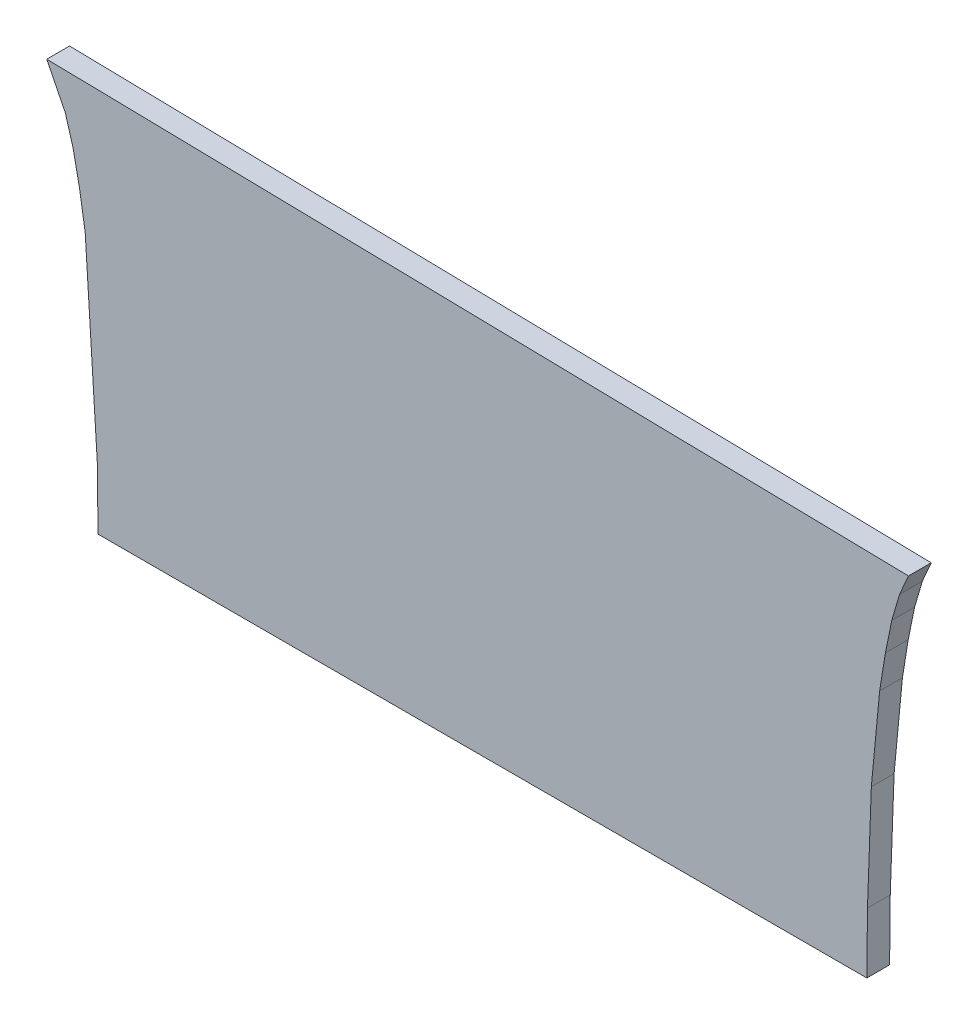
ISO-10303-21;
HEADER;
FILE_DESCRIPTION(('STEP AP214'),'2;1');
FILE_NAME('part.step','',(''),(''),'','','');
FILE_SCHEMA(('AUTOMOTIVE_DESIGN { 1 0 10303 214 1 1 1 1 }'));
ENDSEC;
DATA;
#1=APPLICATION_CONTEXT('core data for automotive mechanical design processes');
#2=APPLICATION_PROTOCOL_DEFINITION('international standard','automotive_design',2000,#1);
#3=PRODUCT_CONTEXT('',#1,'mechanical');
#4=PRODUCT('Part','Part','',(#3));
#5=PRODUCT_RELATED_PRODUCT_CATEGORY('part','',(#4));
#6=PRODUCT_DEFINITION_FORMATION('','',#4);
#7=PRODUCT_DEFINITION_CONTEXT('part definition',#1,'design');
#8=PRODUCT_DEFINITION('design','',#6,#7);
#9=PRODUCT_DEFINITION_SHAPE('','',#8);
#10=(LENGTH_UNIT() NAMED_UNIT(*) SI_UNIT(.MILLI.,.METRE.));
#11=(NAMED_UNIT(*) PLANE_ANGLE_UNIT() SI_UNIT($,.RADIAN.));
#12=(NAMED_UNIT(*) SI_UNIT($,.STERADIAN.) SOLID_ANGLE_UNIT());
#13=UNCERTAINTY_MEASURE_WITH_UNIT(LENGTH_MEASURE(1.E-05),#10,'distance_accuracy_value','');
#14=(GEOMETRIC_REPRESENTATION_CONTEXT(3) GLOBAL_UNCERTAINTY_ASSIGNED_CONTEXT((#13)) GLOBAL_UNIT_ASSIGNED_CONTEXT((#10,
#11,#12)) REPRESENTATION_CONTEXT('',''));
#15=CARTESIAN_POINT('',(0.,0.,0.));
#16=DIRECTION('',(0.,0.,1.));
#17=DIRECTION('',(1.,0.,0.));
#18=AXIS2_PLACEMENT_3D('',#15,#16,#17);
#19=CARTESIAN_POINT('',(67.379997253418,84.3880004882812,0.));
#20=DIRECTION('',(-0.999944665202742,0.010519816185477,0.));
#21=DIRECTION('',(0.010519816185477,0.999944665202742,0.));
#22=AXIS2_PLACEMENT_3D('',#19,#20,#21);
#23=PLANE('',#22);
#24=DIRECTION('',(0.010519816185477,0.999944665202742,0.));
#25=VECTOR('',#24,1.);
#26=CARTESIAN_POINT('',(67.379997253418,84.3880004882812,0.03556));
#27=LINE('',#26,#25);
#28=CARTESIAN_POINT('',(67.379997253418,84.3880004882812,0.03556));
#29=VERTEX_POINT('',#28);
#30=CARTESIAN_POINT('',(67.3809967041016,84.4830017089844,0.03556));
#31=VERTEX_POINT('',#30);
#32=EDGE_CURVE('E11',#29,#31,#27,.T.);
#33=ORIENTED_EDGE('',*,*,#32,.F.);
#34=DIRECTION('',(0.,0.,1.));
#35=VECTOR('',#34,1.);
#36=CARTESIAN_POINT('',(67.379997253418,84.3880004882812,0.));
#37=LINE('',#36,#35);
#38=CARTESIAN_POINT('',(67.379997253418,84.3880004882812,0.));
#39=VERTEX_POINT('',#38);
#40=EDGE_CURVE('E24',#39,#29,#37,.T.);
#41=ORIENTED_EDGE('',*,*,#40,.F.);
#42=DIRECTION('',(0.010519816185477,0.999944665202742,0.));
#43=VECTOR('',#42,1.);
#44=CARTESIAN_POINT('',(67.379997253418,84.3880004882812,0.));
#45=LINE('',#44,#43);
#46=CARTESIAN_POINT('',(67.3809967041016,84.4830017089844,0.));
#47=VERTEX_POINT('',#46);
#48=EDGE_CURVE('E142',#39,#47,#45,.T.);
#49=ORIENTED_EDGE('',*,*,#48,.T.);
#50=DIRECTION('',(0.,0.,1.));
#51=VECTOR('',#50,1.);
#52=CARTESIAN_POINT('',(67.3809967041016,84.4830017089844,0.));
#53=LINE('',#52,#51);
#54=EDGE_CURVE('E37',#47,#31,#53,.T.);
#55=ORIENTED_EDGE('',*,*,#54,.T.);
#56=EDGE_LOOP('',(#33,#41,#49,#55));
#57=FACE_BOUND('',#56,.T.);
#58=ADVANCED_FACE('F17',(#57),#23,.F.);
#59=CARTESIAN_POINT('',(67.3809967041016,84.4830017089844,0.));
#60=DIRECTION('',(-0.999354276166242,0.0359309157724351,0.));
#61=DIRECTION('',(0.0359309157724351,0.999354276166242,0.));
#62=AXIS2_PLACEMENT_3D('',#59,#60,#61);
#63=PLANE('',#62);
#64=DIRECTION('',(0.0359309157724351,0.999354276166242,0.));
#65=VECTOR('',#64,1.);
#66=CARTESIAN_POINT('',(67.3809967041016,84.4830017089844,0.03556));
#67=LINE('',#66,#65);
#68=CARTESIAN_POINT('',(67.3870010375977,84.6500015258789,0.03556));
#69=VERTEX_POINT('',#68);
#70=EDGE_CURVE('E238',#31,#69,#67,.T.);
#71=ORIENTED_EDGE('',*,*,#70,.F.);
#72=ORIENTED_EDGE('',*,*,#54,.F.);
#73=DIRECTION('',(0.0359309157724351,0.999354276166242,0.));
#74=VECTOR('',#73,1.);
#75=CARTESIAN_POINT('',(67.3809967041016,84.4830017089844,0.));
#76=LINE('',#75,#74);
#77=CARTESIAN_POINT('',(67.3870010375977,84.6500015258789,0.));
#78=VERTEX_POINT('',#77);
#79=EDGE_CURVE('E235',#47,#78,#76,.T.);
#80=ORIENTED_EDGE('',*,*,#79,.T.);
#81=DIRECTION('',(0.,0.,1.));
#82=VECTOR('',#81,1.);
#83=CARTESIAN_POINT('',(67.3870010375977,84.6500015258789,0.));
#84=LINE('',#83,#82);
#85=EDGE_CURVE('E233',#78,#69,#84,.T.);
#86=ORIENTED_EDGE('',*,*,#85,.T.);
#87=EDGE_LOOP('',(#71,#72,#80,#86));
#88=FACE_BOUND('',#87,.T.);
#89=ADVANCED_FACE('F246',(#88),#63,.F.);
#90=CARTESIAN_POINT('',(67.3870010375977,84.6500015258789,0.));
#91=DIRECTION('',(-0.99546228232144,0.0951569465430121,0.));
#92=DIRECTION('',(0.0951569465430121,0.99546228232144,0.));
#93=AXIS2_PLACEMENT_3D('',#90,#91,#92);
#94=PLANE('',#93);
#95=DIRECTION('',(0.0951569465430121,0.99546228232144,0.));
#96=VECTOR('',#95,1.);
#97=CARTESIAN_POINT('',(67.3870010375977,84.6500015258789,0.03556));
#98=LINE('',#97,#96);
#99=CARTESIAN_POINT('',(67.4000015258789,84.786003112793,0.03556));
#100=VERTEX_POINT('',#99);
#101=EDGE_CURVE('E230',#69,#100,#98,.T.);
#102=ORIENTED_EDGE('',*,*,#101,.F.);
#103=ORIENTED_EDGE('',*,*,#85,.F.);
#104=DIRECTION('',(0.0951569465430121,0.99546228232144,0.));
#105=VECTOR('',#104,1.);
#106=CARTESIAN_POINT('',(67.3870010375977,84.6500015258789,0.));
#107=LINE('',#106,#105);
#108=CARTESIAN_POINT('',(67.4000015258789,84.786003112793,0.));
#109=VERTEX_POINT('',#108);
#110=EDGE_CURVE('E227',#78,#109,#107,.T.);
#111=ORIENTED_EDGE('',*,*,#110,.T.);
#112=DIRECTION('',(0.,0.,1.));
#113=VECTOR('',#112,1.);
#114=CARTESIAN_POINT('',(67.4000015258789,84.786003112793,0.));
#115=LINE('',#114,#113);
#116=EDGE_CURVE('E225',#109,#100,#115,.T.);
#117=ORIENTED_EDGE('',*,*,#116,.T.);
#118=EDGE_LOOP('',(#102,#103,#111,#117));
#119=FACE_BOUND('',#118,.T.);
#120=ADVANCED_FACE('F252',(#119),#94,.F.);
#121=CARTESIAN_POINT('',(67.4000015258789,84.786003112793,0.));
#122=DIRECTION('',(-0.987343915402215,0.158593797855478,0.));
#123=DIRECTION('',(0.158593797855478,0.987343915402215,0.));
#124=AXIS2_PLACEMENT_3D('',#121,#122,#123);
#125=PLANE('',#124);
#126=DIRECTION('',(0.158593797855478,0.987343915402215,0.));
#127=VECTOR('',#126,1.);
#128=CARTESIAN_POINT('',(67.4000015258789,84.786003112793,0.03556));
#129=LINE('',#128,#127);
#130=CARTESIAN_POINT('',(67.4089965820312,84.8420028686523,0.03556));
#131=VERTEX_POINT('',#130);
#132=EDGE_CURVE('E222',#100,#131,#129,.T.);
#133=ORIENTED_EDGE('',*,*,#132,.F.);
#134=ORIENTED_EDGE('',*,*,#116,.F.);
#135=DIRECTION('',(0.158593797855478,0.987343915402215,0.));
#136=VECTOR('',#135,1.);
#137=CARTESIAN_POINT('',(67.4000015258789,84.786003112793,0.));
#138=LINE('',#137,#136);
#139=CARTESIAN_POINT('',(67.4089965820312,84.8420028686523,0.));
#140=VERTEX_POINT('',#139);
#141=EDGE_CURVE('E219',#109,#140,#138,.T.);
#142=ORIENTED_EDGE('',*,*,#141,.T.);
#143=DIRECTION('',(0.,0.,1.));
#144=VECTOR('',#143,1.);
#145=CARTESIAN_POINT('',(67.4089965820312,84.8420028686523,0.));
#146=LINE('',#145,#144);
#147=EDGE_CURVE('E217',#140,#131,#146,.T.);
#148=ORIENTED_EDGE('',*,*,#147,.T.);
#149=EDGE_LOOP('',(#133,#134,#142,#148));
#150=FACE_BOUND('',#149,.T.);
#151=ADVANCED_FACE('F254',(#150),#125,.F.);
#152=CARTESIAN_POINT('',(67.4089965820312,84.8420028686523,0.));
#153=DIRECTION('',(-0.979792466593502,0.200016805310508,0.));
#154=DIRECTION('',(0.200016805310508,0.979792466593502,0.));
#155=AXIS2_PLACEMENT_3D('',#152,#153,#154);
#156=PLANE('',#155);
#157=DIRECTION('',(0.200016805310508,0.979792466593502,0.));
#158=VECTOR('',#157,1.);
#159=CARTESIAN_POINT('',(67.4089965820312,84.8420028686523,0.03556));
#160=LINE('',#159,#158);
#161=CARTESIAN_POINT('',(67.4189987182617,84.890998840332,0.03556));
#162=VERTEX_POINT('',#161);
#163=EDGE_CURVE('E214',#131,#162,#160,.T.);
#164=ORIENTED_EDGE('',*,*,#163,.F.);
#165=ORIENTED_EDGE('',*,*,#147,.F.);
#166=DIRECTION('',(0.200016805310508,0.979792466593502,0.));
#167=VECTOR('',#166,1.);
#168=CARTESIAN_POINT('',(67.4089965820312,84.8420028686523,0.));
#169=LINE('',#168,#167);
#170=CARTESIAN_POINT('',(67.4189987182617,84.890998840332,0.));
#171=VERTEX_POINT('',#170);
#172=EDGE_CURVE('E211',#140,#171,#169,.T.);
#173=ORIENTED_EDGE('',*,*,#172,.T.);
#174=DIRECTION('',(0.,0.,1.));
#175=VECTOR('',#174,1.);
#176=CARTESIAN_POINT('',(67.4189987182617,84.890998840332,0.));
#177=LINE('',#176,#175);
#178=EDGE_CURVE('E209',#171,#162,#177,.T.);
#179=ORIENTED_EDGE('',*,*,#178,.T.);
#180=EDGE_LOOP('',(#164,#165,#173,#179));
#181=FACE_BOUND('',#180,.T.);
#182=ADVANCED_FACE('F259',(#181),#156,.F.);
#183=CARTESIAN_POINT('',(67.4189987182617,84.890998840332,0.));
#184=DIRECTION('',(-0.959731535414619,0.280918813771343,0.));
#185=DIRECTION('',(0.280918813771343,0.959731535414619,0.));
#186=AXIS2_PLACEMENT_3D('',#183,#184,#185);
#187=PLANE('',#186);
#188=DIRECTION('',(0.280918813771343,0.959731535414619,0.));
#189=VECTOR('',#188,1.);
#190=CARTESIAN_POINT('',(67.4189987182617,84.890998840332,0.03556));
#191=LINE('',#190,#189);
#192=CARTESIAN_POINT('',(67.4309997558594,84.931999206543,0.03556));
#193=VERTEX_POINT('',#192);
#194=EDGE_CURVE('E206',#162,#193,#191,.T.);
#195=ORIENTED_EDGE('',*,*,#194,.F.);
#196=ORIENTED_EDGE('',*,*,#178,.F.);
#197=DIRECTION('',(0.280918813771343,0.959731535414619,0.));
#198=VECTOR('',#197,1.);
#199=CARTESIAN_POINT('',(67.4189987182617,84.890998840332,0.));
#200=LINE('',#199,#198);
#201=CARTESIAN_POINT('',(67.4309997558594,84.931999206543,0.));
#202=VERTEX_POINT('',#201);
#203=EDGE_CURVE('E203',#171,#202,#200,.T.);
#204=ORIENTED_EDGE('',*,*,#203,.T.);
#205=DIRECTION('',(0.,0.,1.));
#206=VECTOR('',#205,1.);
#207=CARTESIAN_POINT('',(67.4309997558594,84.931999206543,0.));
#208=LINE('',#207,#206);
#209=EDGE_CURVE('E201',#202,#193,#208,.T.);
#210=ORIENTED_EDGE('',*,*,#209,.T.);
#211=EDGE_LOOP('',(#195,#196,#204,#210));
#212=FACE_BOUND('',#211,.T.);
#213=ADVANCED_FACE('F262',(#212),#187,.F.);
#214=CARTESIAN_POINT('',(67.4309997558594,84.931999206543,0.));
#215=DIRECTION('',(-0.916147307752552,0.400841752438229,0.));
#216=DIRECTION('',(0.400841752438229,0.916147307752552,0.));
#217=AXIS2_PLACEMENT_3D('',#214,#215,#216);
#218=PLANE('',#217);
#219=DIRECTION('',(0.400841752438229,0.916147307752552,0.));
#220=VECTOR('',#219,1.);
#221=CARTESIAN_POINT('',(67.4309997558594,84.931999206543,0.03556));
#222=LINE('',#221,#220);
#223=CARTESIAN_POINT('',(67.4449996948242,84.963996887207,0.03556));
#224=VERTEX_POINT('',#223);
#225=EDGE_CURVE('E198',#193,#224,#222,.T.);
#226=ORIENTED_EDGE('',*,*,#225,.F.);
#227=ORIENTED_EDGE('',*,*,#209,.F.);
#228=DIRECTION('',(0.400841752438229,0.916147307752552,0.));
#229=VECTOR('',#228,1.);
#230=CARTESIAN_POINT('',(67.4309997558594,84.931999206543,0.));
#231=LINE('',#230,#229);
#232=CARTESIAN_POINT('',(67.4449996948242,84.963996887207,0.));
#233=VERTEX_POINT('',#232);
#234=EDGE_CURVE('E195',#202,#233,#231,.T.);
#235=ORIENTED_EDGE('',*,*,#234,.T.);
#236=DIRECTION('',(0.,0.,1.));
#237=VECTOR('',#236,1.);
#238=CARTESIAN_POINT('',(67.4449996948242,84.963996887207,0.));
#239=LINE('',#238,#237);
#240=EDGE_CURVE('E193',#233,#224,#239,.T.);
#241=ORIENTED_EDGE('',*,*,#240,.T.);
#242=EDGE_LOOP('',(#226,#227,#235,#241));
#243=FACE_BOUND('',#242,.T.);
#244=ADVANCED_FACE('F267',(#243),#218,.F.);
#245=CARTESIAN_POINT('',(67.4449996948242,84.963996887207,0.));
#246=DIRECTION('',(-0.0193279523614092,-0.999813197681205,0.));
#247=DIRECTION('',(-0.999813197681205,0.0193279523614092,0.));
#248=AXIS2_PLACEMENT_3D('',#245,#246,#247);
#249=PLANE('',#248);
#250=DIRECTION('',(-0.999813197681205,0.0193279523614092,0.));
#251=VECTOR('',#250,1.);
#252=CARTESIAN_POINT('',(67.4449996948242,84.963996887207,0.03556));
#253=LINE('',#252,#251);
#254=CARTESIAN_POINT('',(66.0999984741211,84.9899978637695,0.03556));
#255=VERTEX_POINT('',#254);
#256=EDGE_CURVE('E190',#224,#255,#253,.T.);
#257=ORIENTED_EDGE('',*,*,#256,.F.);
#258=ORIENTED_EDGE('',*,*,#240,.F.);
#259=DIRECTION('',(-0.999813197681205,0.0193279523614092,0.));
#260=VECTOR('',#259,1.);
#261=CARTESIAN_POINT('',(67.4449996948242,84.963996887207,0.));
#262=LINE('',#261,#260);
#263=CARTESIAN_POINT('',(66.0999984741211,84.9899978637695,0.));
#264=VERTEX_POINT('',#263);
#265=EDGE_CURVE('E187',#233,#264,#262,.T.);
#266=ORIENTED_EDGE('',*,*,#265,.T.);
#267=DIRECTION('',(0.,0.,1.));
#268=VECTOR('',#267,1.);
#269=CARTESIAN_POINT('',(66.0999984741211,84.9899978637695,0.));
#270=LINE('',#269,#268);
#271=EDGE_CURVE('E185',#264,#255,#270,.T.);
#272=ORIENTED_EDGE('',*,*,#271,.T.);
#273=EDGE_LOOP('',(#257,#258,#266,#272));
#274=FACE_BOUND('',#273,.T.);
#275=ADVANCED_FACE('F270',(#274),#249,.F.);
#276=CARTESIAN_POINT('',(66.0999984741211,84.9899978637695,0.));
#277=DIRECTION('',(0.894427190999916,0.447213595499958,0.));
#278=DIRECTION('',(0.447213595499958,-0.894427190999916,0.));
#279=AXIS2_PLACEMENT_3D('',#276,#277,#278);
#280=PLANE('',#279);
#281=DIRECTION('',(0.447213595499958,-0.894427190999916,0.));
#282=VECTOR('',#281,1.);
#283=CARTESIAN_POINT('',(66.0999984741211,84.9899978637695,0.03556));
#284=LINE('',#283,#282);
#285=CARTESIAN_POINT('',(66.1289978027344,84.931999206543,0.03556));
#286=VERTEX_POINT('',#285);
#287=EDGE_CURVE('E182',#255,#286,#284,.T.);
#288=ORIENTED_EDGE('',*,*,#287,.F.);
#289=ORIENTED_EDGE('',*,*,#271,.F.);
#290=DIRECTION('',(0.447213595499958,-0.894427190999916,0.));
#291=VECTOR('',#290,1.);
#292=CARTESIAN_POINT('',(66.0999984741211,84.9899978637695,0.));
#293=LINE('',#292,#291);
#294=CARTESIAN_POINT('',(66.1289978027344,84.931999206543,0.));
#295=VERTEX_POINT('',#294);
#296=EDGE_CURVE('E179',#264,#295,#293,.T.);
#297=ORIENTED_EDGE('',*,*,#296,.T.);
#298=DIRECTION('',(0.,0.,1.));
#299=VECTOR('',#298,1.);
#300=CARTESIAN_POINT('',(66.1289978027344,84.931999206543,0.));
#301=LINE('',#300,#299);
#302=EDGE_CURVE('E177',#295,#286,#301,.T.);
#303=ORIENTED_EDGE('',*,*,#302,.T.);
#304=EDGE_LOOP('',(#288,#289,#297,#303));
#305=FACE_BOUND('',#304,.T.);
#306=ADVANCED_FACE('F275',(#305),#280,.F.);
#307=CARTESIAN_POINT('',(66.1289978027344,84.931999206543,0.));
#308=DIRECTION('',(0.959731535414619,0.280918813771343,0.));
#309=DIRECTION('',(0.280918813771343,-0.959731535414619,0.));
#310=AXIS2_PLACEMENT_3D('',#307,#308,#309);
#311=PLANE('',#310);
#312=DIRECTION('',(0.280918813771343,-0.959731535414619,0.));
#313=VECTOR('',#312,1.);
#314=CARTESIAN_POINT('',(66.1289978027344,84.931999206543,0.03556));
#315=LINE('',#314,#313);
#316=CARTESIAN_POINT('',(66.140998840332,84.890998840332,0.03556));
#317=VERTEX_POINT('',#316);
#318=EDGE_CURVE('E174',#286,#317,#315,.T.);
#319=ORIENTED_EDGE('',*,*,#318,.F.);
#320=ORIENTED_EDGE('',*,*,#302,.F.);
#321=DIRECTION('',(0.280918813771343,-0.959731535414619,0.));
#322=VECTOR('',#321,1.);
#323=CARTESIAN_POINT('',(66.1289978027344,84.931999206543,0.));
#324=LINE('',#323,#322);
#325=CARTESIAN_POINT('',(66.140998840332,84.890998840332,0.));
#326=VERTEX_POINT('',#325);
#327=EDGE_CURVE('E171',#295,#326,#324,.T.);
#328=ORIENTED_EDGE('',*,*,#327,.T.);
#329=DIRECTION('',(0.,0.,1.));
#330=VECTOR('',#329,1.);
#331=CARTESIAN_POINT('',(66.140998840332,84.890998840332,0.));
#332=LINE('',#331,#330);
#333=EDGE_CURVE('E169',#326,#317,#332,.T.);
#334=ORIENTED_EDGE('',*,*,#333,.T.);
#335=EDGE_LOOP('',(#319,#320,#328,#334));
#336=FACE_BOUND('',#335,.T.);
#337=ADVANCED_FACE('F278',(#336),#311,.F.);
#338=CARTESIAN_POINT('',(66.140998840332,84.890998840332,0.));
#339=DIRECTION('',(0.979792466593502,0.200016805310508,0.));
#340=DIRECTION('',(0.200016805310508,-0.979792466593502,0.));
#341=AXIS2_PLACEMENT_3D('',#338,#339,#340);
#342=PLANE('',#341);
#343=DIRECTION('',(0.200016805310508,-0.979792466593502,0.));
#344=VECTOR('',#343,1.);
#345=CARTESIAN_POINT('',(66.140998840332,84.890998840332,0.03556));
#346=LINE('',#345,#344);
#347=CARTESIAN_POINT('',(66.1510009765625,84.8420028686523,0.03556));
#348=VERTEX_POINT('',#347);
#349=EDGE_CURVE('E166',#317,#348,#346,.T.);
#350=ORIENTED_EDGE('',*,*,#349,.F.);
#351=ORIENTED_EDGE('',*,*,#333,.F.);
#352=DIRECTION('',(0.200016805310508,-0.979792466593502,0.));
#353=VECTOR('',#352,1.);
#354=CARTESIAN_POINT('',(66.140998840332,84.890998840332,0.));
#355=LINE('',#354,#353);
#356=CARTESIAN_POINT('',(66.1510009765625,84.8420028686523,0.));
#357=VERTEX_POINT('',#356);
#358=EDGE_CURVE('E163',#326,#357,#355,.T.);
#359=ORIENTED_EDGE('',*,*,#358,.T.);
#360=DIRECTION('',(0.,0.,1.));
#361=VECTOR('',#360,1.);
#362=CARTESIAN_POINT('',(66.1510009765625,84.8420028686523,0.));
#363=LINE('',#362,#361);
#364=EDGE_CURVE('E161',#357,#348,#363,.T.);
#365=ORIENTED_EDGE('',*,*,#364,.T.);
#366=EDGE_LOOP('',(#350,#351,#359,#365));
#367=FACE_BOUND('',#366,.T.);
#368=ADVANCED_FACE('F283',(#367),#342,.F.);
#369=CARTESIAN_POINT('',(66.1510009765625,84.8420028686523,0.));
#370=DIRECTION('',(0.987322843813315,0.158724925844647,0.));
#371=DIRECTION('',(0.158724925844647,-0.987322843813315,0.));
#372=AXIS2_PLACEMENT_3D('',#369,#370,#371);
#373=PLANE('',#372);
#374=DIRECTION('',(0.158724925844647,-0.987322843813315,0.));
#375=VECTOR('',#374,1.);
#376=CARTESIAN_POINT('',(66.1510009765625,84.8420028686523,0.03556));
#377=LINE('',#376,#375);
#378=CARTESIAN_POINT('',(66.1600036621094,84.786003112793,0.03556));
#379=VERTEX_POINT('',#378);
#380=EDGE_CURVE('E158',#348,#379,#377,.T.);
#381=ORIENTED_EDGE('',*,*,#380,.F.);
#382=ORIENTED_EDGE('',*,*,#364,.F.);
#383=DIRECTION('',(0.158724925844647,-0.987322843813315,0.));
#384=VECTOR('',#383,1.);
#385=CARTESIAN_POINT('',(66.1510009765625,84.8420028686523,0.));
#386=LINE('',#385,#384);
#387=CARTESIAN_POINT('',(66.1600036621094,84.786003112793,0.));
#388=VERTEX_POINT('',#387);
#389=EDGE_CURVE('E155',#357,#388,#386,.T.);
#390=ORIENTED_EDGE('',*,*,#389,.T.);
#391=DIRECTION('',(0.,0.,1.));
#392=VECTOR('',#391,1.);
#393=CARTESIAN_POINT('',(66.1600036621094,84.786003112793,0.));
#394=LINE('',#393,#392);
#395=EDGE_CURVE('E153',#388,#379,#394,.T.);
#396=ORIENTED_EDGE('',*,*,#395,.T.);
#397=EDGE_LOOP('',(#381,#382,#390,#396));
#398=FACE_BOUND('',#397,.T.);
#399=ADVANCED_FACE('F286',(#398),#373,.F.);
#400=CARTESIAN_POINT('',(66.1600036621094,84.786003112793,0.));
#401=DIRECTION('',(0.998040336530932,0.0625738496276475,0.));
#402=DIRECTION('',(0.0625738496276475,-0.998040336530932,0.));
#403=AXIS2_PLACEMENT_3D('',#400,#401,#402);
#404=PLANE('',#403);
#405=DIRECTION('',(0.0625738496276475,-0.998040336530932,0.));
#406=VECTOR('',#405,1.);
#407=CARTESIAN_POINT('',(66.1600036621094,84.786003112793,0.03556));
#408=LINE('',#407,#406);
#409=CARTESIAN_POINT('',(66.1790008544922,84.4830017089844,0.03556));
#410=VERTEX_POINT('',#409);
#411=EDGE_CURVE('E150',#379,#410,#408,.T.);
#412=ORIENTED_EDGE('',*,*,#411,.F.);
#413=ORIENTED_EDGE('',*,*,#395,.F.);
#414=DIRECTION('',(0.0625738496276475,-0.998040336530932,0.));
#415=VECTOR('',#414,1.);
#416=CARTESIAN_POINT('',(66.1600036621094,84.786003112793,0.));
#417=LINE('',#416,#415);
#418=CARTESIAN_POINT('',(66.1790008544922,84.4830017089844,0.));
#419=VERTEX_POINT('',#418);
#420=EDGE_CURVE('E148',#388,#419,#417,.T.);
#421=ORIENTED_EDGE('',*,*,#420,.T.);
#422=DIRECTION('',(0.,0.,1.));
#423=VECTOR('',#422,1.);
#424=CARTESIAN_POINT('',(66.1790008544922,84.4830017089844,0.));
#425=LINE('',#424,#423);
#426=EDGE_CURVE('E133',#419,#410,#425,.T.);
#427=ORIENTED_EDGE('',*,*,#426,.T.);
#428=EDGE_LOOP('',(#412,#413,#421,#427));
#429=FACE_BOUND('',#428,.T.);
#430=ADVANCED_FACE('F289',(#429),#404,.F.);
#431=CARTESIAN_POINT('',(66.1790008544922,84.4830017089844,0.));
#432=DIRECTION('',(0.999944665202742,0.010519816185477,0.));
#433=DIRECTION('',(0.010519816185477,-0.999944665202742,0.));
#434=AXIS2_PLACEMENT_3D('',#431,#432,#433);
#435=PLANE('',#434);
#436=DIRECTION('',(0.010519816185477,-0.999944665202742,0.));
#437=VECTOR('',#436,1.);
#438=CARTESIAN_POINT('',(66.1790008544922,84.4830017089844,0.03556));
#439=LINE('',#438,#437);
#440=CARTESIAN_POINT('',(66.1800003051758,84.3880004882812,0.03556));
#441=VERTEX_POINT('',#440);
#442=EDGE_CURVE('E137',#410,#441,#439,.T.);
#443=ORIENTED_EDGE('',*,*,#442,.F.);
#444=ORIENTED_EDGE('',*,*,#426,.F.);
#445=DIRECTION('',(0.010519816185477,-0.999944665202742,0.));
#446=VECTOR('',#445,1.);
#447=CARTESIAN_POINT('',(66.1790008544922,84.4830017089844,0.));
#448=LINE('',#447,#446);
#449=CARTESIAN_POINT('',(66.1800003051758,84.3880004882812,0.));
#450=VERTEX_POINT('',#449);
#451=EDGE_CURVE('E129',#419,#450,#448,.T.);
#452=ORIENTED_EDGE('',*,*,#451,.T.);
#453=DIRECTION('',(0.,0.,1.));
#454=VECTOR('',#453,1.);
#455=CARTESIAN_POINT('',(66.1800003051758,84.3880004882812,0.));
#456=LINE('',#455,#454);
#457=EDGE_CURVE('E119',#450,#441,#456,.T.);
#458=ORIENTED_EDGE('',*,*,#457,.T.);
#459=EDGE_LOOP('',(#443,#444,#452,#458));
#460=FACE_BOUND('',#459,.T.);
#461=ADVANCED_FACE('F132',(#460),#435,.F.);
#462=CARTESIAN_POINT('',(66.1800003051758,84.3880004882812,0.));
#463=DIRECTION('',(0.,1.,0.));
#464=DIRECTION('',(1.,0.,0.));
#465=AXIS2_PLACEMENT_3D('',#462,#463,#464);
#466=PLANE('',#465);
#467=DIRECTION('',(1.,0.,0.));
#468=VECTOR('',#467,1.);
#469=CARTESIAN_POINT('',(66.1800003051758,84.3880004882812,0.03556));
#470=LINE('',#469,#468);
#471=EDGE_CURVE('E125',#441,#29,#470,.T.);
#472=ORIENTED_EDGE('',*,*,#471,.F.);
#473=ORIENTED_EDGE('',*,*,#457,.F.);
#474=DIRECTION('',(1.,0.,0.));
#475=VECTOR('',#474,1.);
#476=CARTESIAN_POINT('',(66.1800003051758,84.3880004882812,0.));
#477=LINE('',#476,#475);
#478=EDGE_CURVE('E123',#450,#39,#477,.T.);
#479=ORIENTED_EDGE('',*,*,#478,.T.);
#480=ORIENTED_EDGE('',*,*,#40,.T.);
#481=EDGE_LOOP('',(#472,#473,#479,#480));
#482=FACE_BOUND('',#481,.T.);
#483=ADVANCED_FACE('F121',(#482),#466,.F.);
#484=CARTESIAN_POINT('',(67.379997253418,84.3880004882812,0.));
#485=DIRECTION('',(0.,0.,1.));
#486=DIRECTION('',(1.,0.,0.));
#487=AXIS2_PLACEMENT_3D('',#484,#485,#486);
#488=PLANE('',#487);
#489=ORIENTED_EDGE('',*,*,#478,.F.);
#490=ORIENTED_EDGE('',*,*,#451,.F.);
#491=ORIENTED_EDGE('',*,*,#420,.F.);
#492=ORIENTED_EDGE('',*,*,#389,.F.);
#493=ORIENTED_EDGE('',*,*,#358,.F.);
#494=ORIENTED_EDGE('',*,*,#327,.F.);
#495=ORIENTED_EDGE('',*,*,#296,.F.);
#496=ORIENTED_EDGE('',*,*,#265,.F.);
#497=ORIENTED_EDGE('',*,*,#234,.F.);
#498=ORIENTED_EDGE('',*,*,#203,.F.);
#499=ORIENTED_EDGE('',*,*,#172,.F.);
#500=ORIENTED_EDGE('',*,*,#141,.F.);
#501=ORIENTED_EDGE('',*,*,#110,.F.);
#502=ORIENTED_EDGE('',*,*,#79,.F.);
#503=ORIENTED_EDGE('',*,*,#48,.F.);
#504=EDGE_LOOP('',(#489,#490,#491,#492,#493,#494,#495,#496,#497,#498,#499,#500,#501,#502,#503));
#505=FACE_BOUND('',#504,.T.);
#506=ADVANCED_FACE('F140',(#505),#488,.F.);
#507=CARTESIAN_POINT('',(67.379997253418,84.3880004882812,0.03556));
#508=DIRECTION('',(0.,0.,1.));
#509=DIRECTION('',(1.,0.,0.));
#510=AXIS2_PLACEMENT_3D('',#507,#508,#509);
#511=PLANE('',#510);
#512=ORIENTED_EDGE('',*,*,#32,.T.);
#513=ORIENTED_EDGE('',*,*,#70,.T.);
#514=ORIENTED_EDGE('',*,*,#101,.T.);
#515=ORIENTED_EDGE('',*,*,#132,.T.);
#516=ORIENTED_EDGE('',*,*,#163,.T.);
#517=ORIENTED_EDGE('',*,*,#194,.T.);
#518=ORIENTED_EDGE('',*,*,#225,.T.);
#519=ORIENTED_EDGE('',*,*,#256,.T.);
#520=ORIENTED_EDGE('',*,*,#287,.T.);
#521=ORIENTED_EDGE('',*,*,#318,.T.);
#522=ORIENTED_EDGE('',*,*,#349,.T.);
#523=ORIENTED_EDGE('',*,*,#380,.T.);
#524=ORIENTED_EDGE('',*,*,#411,.T.);
#525=ORIENTED_EDGE('',*,*,#442,.T.);
#526=ORIENTED_EDGE('',*,*,#471,.T.);
#527=EDGE_LOOP('',(#512,#513,#514,#515,#516,#517,#518,#519,#520,#521,#522,#523,#524,#525,#526));
#528=FACE_BOUND('',#527,.T.);
#529=ADVANCED_FACE('F249',(#528),#511,.T.);
#530=CLOSED_SHELL('',(#58,#89,#120,#151,#182,#213,#244,#275,#306,#337,#368,#399,#430,#461,#483,
#506,#529));
#531=MANIFOLD_SOLID_BREP('B1',#530);
#532=ADVANCED_BREP_SHAPE_REPRESENTATION('',(#18,#531),#14);
#533=SHAPE_DEFINITION_REPRESENTATION(#9,#532);
ENDSEC;
END-ISO-10303-21;
